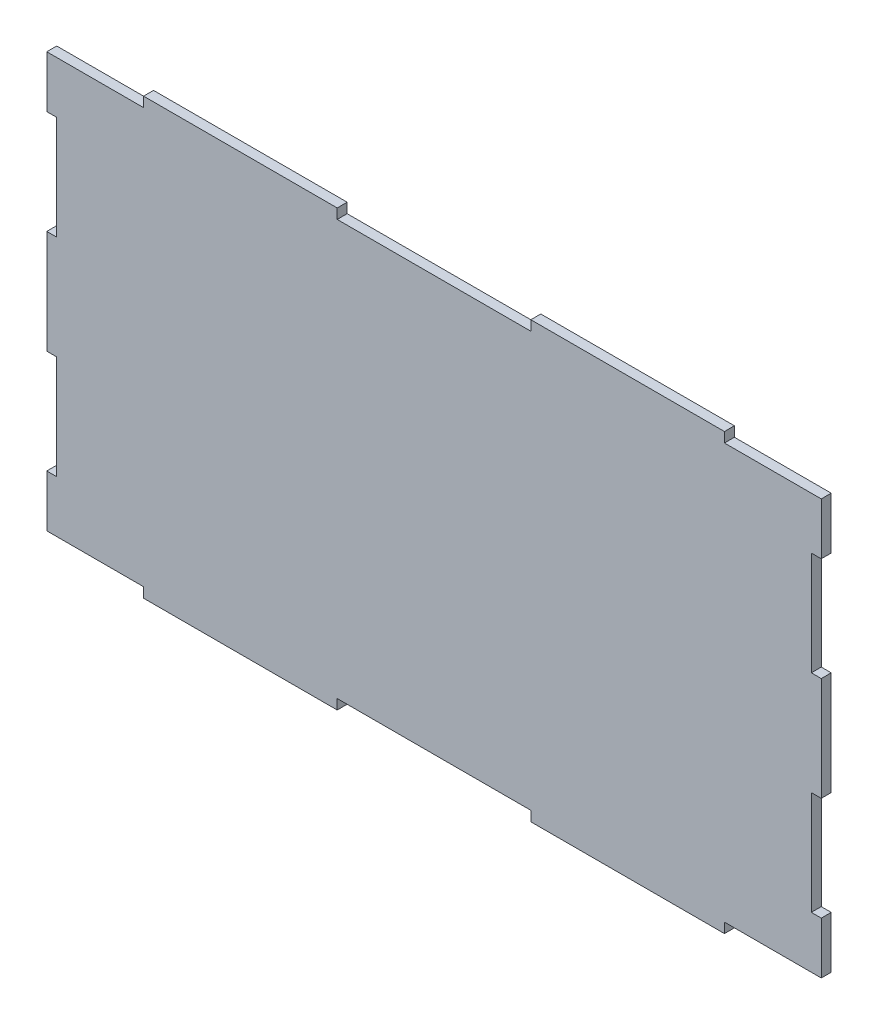
ISO-10303-21;
HEADER;
FILE_DESCRIPTION(('STEP AP214'),'2;1');
FILE_NAME('part.step','',(''),(''),'','','');
FILE_SCHEMA(('AUTOMOTIVE_DESIGN { 1 0 10303 214 1 1 1 1 }'));
ENDSEC;
DATA;
#1=APPLICATION_CONTEXT('core data for automotive mechanical design processes');
#2=APPLICATION_PROTOCOL_DEFINITION('international standard','automotive_design',2000,#1);
#3=PRODUCT_CONTEXT('',#1,'mechanical');
#4=PRODUCT('Part','Part','',(#3));
#5=PRODUCT_RELATED_PRODUCT_CATEGORY('part','',(#4));
#6=PRODUCT_DEFINITION_FORMATION('','',#4);
#7=PRODUCT_DEFINITION_CONTEXT('part definition',#1,'design');
#8=PRODUCT_DEFINITION('design','',#6,#7);
#9=PRODUCT_DEFINITION_SHAPE('','',#8);
#10=(LENGTH_UNIT() NAMED_UNIT(*) SI_UNIT(.MILLI.,.METRE.));
#11=(NAMED_UNIT(*) PLANE_ANGLE_UNIT() SI_UNIT($,.RADIAN.));
#12=(NAMED_UNIT(*) SI_UNIT($,.STERADIAN.) SOLID_ANGLE_UNIT());
#13=UNCERTAINTY_MEASURE_WITH_UNIT(LENGTH_MEASURE(1.E-05),#10,'distance_accuracy_value','');
#14=(GEOMETRIC_REPRESENTATION_CONTEXT(3) GLOBAL_UNCERTAINTY_ASSIGNED_CONTEXT((#13)) GLOBAL_UNIT_ASSIGNED_CONTEXT((#10,
#11,#12)) REPRESENTATION_CONTEXT('',''));
#15=CARTESIAN_POINT('',(0.,0.,0.));
#16=DIRECTION('',(0.,0.,1.));
#17=DIRECTION('',(1.,0.,0.));
#18=AXIS2_PLACEMENT_3D('',#15,#16,#17);
#19=CARTESIAN_POINT('',(140.,-75.,3.6));
#20=DIRECTION('',(-1.,0.,0.));
#21=DIRECTION('',(0.,-1.,0.));
#22=AXIS2_PLACEMENT_3D('',#19,#20,#21);
#23=PLANE('',#22);
#24=DIRECTION('',(0.,1.,0.));
#25=VECTOR('',#24,1.);
#26=CARTESIAN_POINT('',(140.,-75.,0.));
#27=LINE('',#26,#25);
#28=CARTESIAN_POINT('',(140.,-75.,0.));
#29=VERTEX_POINT('',#28);
#30=CARTESIAN_POINT('',(140.,-56.2500000000001,0.));
#31=VERTEX_POINT('',#30);
#32=EDGE_CURVE('E297',#29,#31,#27,.T.);
#33=ORIENTED_EDGE('',*,*,#32,.T.);
#34=DIRECTION('',(0.,0.,-1.));
#35=VECTOR('',#34,1.);
#36=CARTESIAN_POINT('',(140.,-56.2500000000001,3.6));
#37=LINE('',#36,#35);
#38=CARTESIAN_POINT('',(140.,-56.2500000000001,3.6));
#39=VERTEX_POINT('',#38);
#40=EDGE_CURVE('E11',#39,#31,#37,.T.);
#41=ORIENTED_EDGE('',*,*,#40,.F.);
#42=DIRECTION('',(0.,1.,0.));
#43=VECTOR('',#42,1.);
#44=CARTESIAN_POINT('',(140.,-75.,3.6));
#45=LINE('',#44,#43);
#46=CARTESIAN_POINT('',(140.,-75.,3.6));
#47=VERTEX_POINT('',#46);
#48=EDGE_CURVE('E367',#47,#39,#45,.T.);
#49=ORIENTED_EDGE('',*,*,#48,.F.);
#50=DIRECTION('',(0.,0.,-1.));
#51=VECTOR('',#50,1.);
#52=CARTESIAN_POINT('',(140.,-75.,3.6));
#53=LINE('',#52,#51);
#54=EDGE_CURVE('E293',#47,#29,#53,.T.);
#55=ORIENTED_EDGE('',*,*,#54,.T.);
#56=EDGE_LOOP('',(#33,#41,#49,#55));
#57=FACE_BOUND('',#56,.T.);
#58=ADVANCED_FACE('F33',(#57),#23,.F.);
#59=CARTESIAN_POINT('',(140.,-56.2500000000001,3.6));
#60=DIRECTION('',(0.,-1.,0.));
#61=DIRECTION('',(1.,0.,0.));
#62=AXIS2_PLACEMENT_3D('',#59,#60,#61);
#63=PLANE('',#62);
#64=DIRECTION('',(-1.,0.,0.));
#65=VECTOR('',#64,1.);
#66=CARTESIAN_POINT('',(140.,-56.2500000000001,0.));
#67=LINE('',#66,#65);
#68=CARTESIAN_POINT('',(136.4,-56.2500000000001,0.));
#69=VERTEX_POINT('',#68);
#70=EDGE_CURVE('E300',#31,#69,#67,.T.);
#71=ORIENTED_EDGE('',*,*,#70,.T.);
#72=DIRECTION('',(0.,0.,-1.));
#73=VECTOR('',#72,1.);
#74=CARTESIAN_POINT('',(136.4,-56.2500000000001,3.6));
#75=LINE('',#74,#73);
#76=CARTESIAN_POINT('',(136.4,-56.2500000000001,3.6));
#77=VERTEX_POINT('',#76);
#78=EDGE_CURVE('E41',#77,#69,#75,.T.);
#79=ORIENTED_EDGE('',*,*,#78,.F.);
#80=DIRECTION('',(-1.,0.,0.));
#81=VECTOR('',#80,1.);
#82=CARTESIAN_POINT('',(140.,-56.2500000000001,3.6));
#83=LINE('',#82,#81);
#84=EDGE_CURVE('E176',#39,#77,#83,.T.);
#85=ORIENTED_EDGE('',*,*,#84,.F.);
#86=ORIENTED_EDGE('',*,*,#40,.T.);
#87=EDGE_LOOP('',(#71,#79,#85,#86));
#88=FACE_BOUND('',#87,.T.);
#89=ADVANCED_FACE('F565',(#88),#63,.F.);
#90=CARTESIAN_POINT('',(136.4,-56.2500000000001,3.6));
#91=DIRECTION('',(-1.,0.,0.));
#92=DIRECTION('',(0.,-1.,0.));
#93=AXIS2_PLACEMENT_3D('',#90,#91,#92);
#94=PLANE('',#93);
#95=DIRECTION('',(0.,1.,0.));
#96=VECTOR('',#95,1.);
#97=CARTESIAN_POINT('',(136.4,-56.2500000000001,0.));
#98=LINE('',#97,#96);
#99=CARTESIAN_POINT('',(136.4,-18.7500000000001,0.));
#100=VERTEX_POINT('',#99);
#101=EDGE_CURVE('E302',#69,#100,#98,.T.);
#102=ORIENTED_EDGE('',*,*,#101,.T.);
#103=DIRECTION('',(0.,0.,-1.));
#104=VECTOR('',#103,1.);
#105=CARTESIAN_POINT('',(136.4,-18.7500000000001,3.6));
#106=LINE('',#105,#104);
#107=CARTESIAN_POINT('',(136.4,-18.7500000000001,3.6));
#108=VERTEX_POINT('',#107);
#109=EDGE_CURVE('E458',#108,#100,#106,.T.);
#110=ORIENTED_EDGE('',*,*,#109,.F.);
#111=DIRECTION('',(0.,1.,0.));
#112=VECTOR('',#111,1.);
#113=CARTESIAN_POINT('',(136.4,-56.2500000000001,3.6));
#114=LINE('',#113,#112);
#115=EDGE_CURVE('E466',#77,#108,#114,.T.);
#116=ORIENTED_EDGE('',*,*,#115,.F.);
#117=ORIENTED_EDGE('',*,*,#78,.T.);
#118=EDGE_LOOP('',(#102,#110,#116,#117));
#119=FACE_BOUND('',#118,.T.);
#120=ADVANCED_FACE('F464',(#119),#94,.F.);
#121=CARTESIAN_POINT('',(140.,-18.7500000000001,3.6));
#122=DIRECTION('',(0.,1.,0.));
#123=DIRECTION('',(-1.,0.,0.));
#124=AXIS2_PLACEMENT_3D('',#121,#122,#123);
#125=PLANE('',#124);
#126=DIRECTION('',(1.,0.,0.));
#127=VECTOR('',#126,1.);
#128=CARTESIAN_POINT('',(140.,-18.7500000000001,0.));
#129=LINE('',#128,#127);
#130=CARTESIAN_POINT('',(140.,-18.7500000000001,0.));
#131=VERTEX_POINT('',#130);
#132=EDGE_CURVE('E304',#100,#131,#129,.T.);
#133=ORIENTED_EDGE('',*,*,#132,.T.);
#134=DIRECTION('',(0.,0.,-1.));
#135=VECTOR('',#134,1.);
#136=CARTESIAN_POINT('',(140.,-18.7500000000001,3.6));
#137=LINE('',#136,#135);
#138=CARTESIAN_POINT('',(140.,-18.7500000000001,3.6));
#139=VERTEX_POINT('',#138);
#140=EDGE_CURVE('E455',#139,#131,#137,.T.);
#141=ORIENTED_EDGE('',*,*,#140,.F.);
#142=DIRECTION('',(1.,0.,0.));
#143=VECTOR('',#142,1.);
#144=CARTESIAN_POINT('',(140.,-18.7500000000001,3.6));
#145=LINE('',#144,#143);
#146=EDGE_CURVE('E484',#108,#139,#145,.T.);
#147=ORIENTED_EDGE('',*,*,#146,.F.);
#148=ORIENTED_EDGE('',*,*,#109,.T.);
#149=EDGE_LOOP('',(#133,#141,#147,#148));
#150=FACE_BOUND('',#149,.T.);
#151=ADVANCED_FACE('F475',(#150),#125,.F.);
#152=CARTESIAN_POINT('',(140.,18.7499999999999,3.6));
#153=DIRECTION('',(-1.,0.,0.));
#154=DIRECTION('',(0.,-1.,0.));
#155=AXIS2_PLACEMENT_3D('',#152,#153,#154);
#156=PLANE('',#155);
#157=DIRECTION('',(0.,1.,0.));
#158=VECTOR('',#157,1.);
#159=CARTESIAN_POINT('',(140.,18.7499999999999,0.));
#160=LINE('',#159,#158);
#161=CARTESIAN_POINT('',(140.,18.7499999999999,0.));
#162=VERTEX_POINT('',#161);
#163=EDGE_CURVE('E306',#131,#162,#160,.T.);
#164=ORIENTED_EDGE('',*,*,#163,.T.);
#165=DIRECTION('',(0.,0.,-1.));
#166=VECTOR('',#165,1.);
#167=CARTESIAN_POINT('',(140.,18.7499999999999,3.6));
#168=LINE('',#167,#166);
#169=CARTESIAN_POINT('',(140.,18.7499999999999,3.6));
#170=VERTEX_POINT('',#169);
#171=EDGE_CURVE('E452',#170,#162,#168,.T.);
#172=ORIENTED_EDGE('',*,*,#171,.F.);
#173=DIRECTION('',(0.,1.,0.));
#174=VECTOR('',#173,1.);
#175=CARTESIAN_POINT('',(140.,18.7499999999999,3.6));
#176=LINE('',#175,#174);
#177=EDGE_CURVE('E481',#139,#170,#176,.T.);
#178=ORIENTED_EDGE('',*,*,#177,.F.);
#179=ORIENTED_EDGE('',*,*,#140,.T.);
#180=EDGE_LOOP('',(#164,#172,#178,#179));
#181=FACE_BOUND('',#180,.T.);
#182=ADVANCED_FACE('F479',(#181),#156,.F.);
#183=CARTESIAN_POINT('',(140.,18.7499999999999,3.6));
#184=DIRECTION('',(0.,-1.,0.));
#185=DIRECTION('',(0.,0.,-1.));
#186=AXIS2_PLACEMENT_3D('',#183,#184,#185);
#187=PLANE('',#186);
#188=DIRECTION('',(-1.,0.,0.));
#189=VECTOR('',#188,1.);
#190=CARTESIAN_POINT('',(140.,18.7499999999999,0.));
#191=LINE('',#190,#189);
#192=CARTESIAN_POINT('',(136.4,18.7499999999999,0.));
#193=VERTEX_POINT('',#192);
#194=EDGE_CURVE('E308',#162,#193,#191,.T.);
#195=ORIENTED_EDGE('',*,*,#194,.T.);
#196=DIRECTION('',(0.,0.,-1.));
#197=VECTOR('',#196,1.);
#198=CARTESIAN_POINT('',(136.4,18.7499999999999,3.6));
#199=LINE('',#198,#197);
#200=CARTESIAN_POINT('',(136.4,18.7499999999999,3.6));
#201=VERTEX_POINT('',#200);
#202=EDGE_CURVE('E449',#201,#193,#199,.T.);
#203=ORIENTED_EDGE('',*,*,#202,.F.);
#204=DIRECTION('',(-1.,0.,0.));
#205=VECTOR('',#204,1.);
#206=CARTESIAN_POINT('',(140.,18.7499999999999,3.6));
#207=LINE('',#206,#205);
#208=EDGE_CURVE('E483',#170,#201,#207,.T.);
#209=ORIENTED_EDGE('',*,*,#208,.F.);
#210=ORIENTED_EDGE('',*,*,#171,.T.);
#211=EDGE_LOOP('',(#195,#203,#209,#210));
#212=FACE_BOUND('',#211,.T.);
#213=ADVANCED_FACE('F578',(#212),#187,.F.);
#214=CARTESIAN_POINT('',(136.4,56.2499999999999,3.6));
#215=DIRECTION('',(-1.,0.,0.));
#216=DIRECTION('',(0.,-1.,0.));
#217=AXIS2_PLACEMENT_3D('',#214,#215,#216);
#218=PLANE('',#217);
#219=DIRECTION('',(0.,1.,0.));
#220=VECTOR('',#219,1.);
#221=CARTESIAN_POINT('',(136.4,56.2499999999999,0.));
#222=LINE('',#221,#220);
#223=CARTESIAN_POINT('',(136.4,56.2499999999999,0.));
#224=VERTEX_POINT('',#223);
#225=EDGE_CURVE('E310',#193,#224,#222,.T.);
#226=ORIENTED_EDGE('',*,*,#225,.T.);
#227=DIRECTION('',(0.,0.,-1.));
#228=VECTOR('',#227,1.);
#229=CARTESIAN_POINT('',(136.4,56.2499999999999,3.6));
#230=LINE('',#229,#228);
#231=CARTESIAN_POINT('',(136.4,56.2499999999999,3.6));
#232=VERTEX_POINT('',#231);
#233=EDGE_CURVE('E446',#232,#224,#230,.T.);
#234=ORIENTED_EDGE('',*,*,#233,.F.);
#235=DIRECTION('',(0.,1.,0.));
#236=VECTOR('',#235,1.);
#237=CARTESIAN_POINT('',(136.4,56.2499999999999,3.6));
#238=LINE('',#237,#236);
#239=EDGE_CURVE('E486',#201,#232,#238,.T.);
#240=ORIENTED_EDGE('',*,*,#239,.F.);
#241=ORIENTED_EDGE('',*,*,#202,.T.);
#242=EDGE_LOOP('',(#226,#234,#240,#241));
#243=FACE_BOUND('',#242,.T.);
#244=ADVANCED_FACE('F581',(#243),#218,.F.);
#245=CARTESIAN_POINT('',(140.,56.2499999999999,3.6));
#246=DIRECTION('',(0.,1.,0.));
#247=DIRECTION('',(0.,0.,1.));
#248=AXIS2_PLACEMENT_3D('',#245,#246,#247);
#249=PLANE('',#248);
#250=DIRECTION('',(1.,0.,0.));
#251=VECTOR('',#250,1.);
#252=CARTESIAN_POINT('',(140.,56.2499999999999,0.));
#253=LINE('',#252,#251);
#254=CARTESIAN_POINT('',(140.,56.2499999999999,0.));
#255=VERTEX_POINT('',#254);
#256=EDGE_CURVE('E312',#224,#255,#253,.T.);
#257=ORIENTED_EDGE('',*,*,#256,.T.);
#258=DIRECTION('',(0.,0.,-1.));
#259=VECTOR('',#258,1.);
#260=CARTESIAN_POINT('',(140.,56.2499999999999,3.6));
#261=LINE('',#260,#259);
#262=CARTESIAN_POINT('',(140.,56.2499999999999,3.6));
#263=VERTEX_POINT('',#262);
#264=EDGE_CURVE('E443',#263,#255,#261,.T.);
#265=ORIENTED_EDGE('',*,*,#264,.F.);
#266=DIRECTION('',(1.,0.,0.));
#267=VECTOR('',#266,1.);
#268=CARTESIAN_POINT('',(140.,56.2499999999999,3.6));
#269=LINE('',#268,#267);
#270=EDGE_CURVE('E492',#232,#263,#269,.T.);
#271=ORIENTED_EDGE('',*,*,#270,.F.);
#272=ORIENTED_EDGE('',*,*,#233,.T.);
#273=EDGE_LOOP('',(#257,#265,#271,#272));
#274=FACE_BOUND('',#273,.T.);
#275=ADVANCED_FACE('F585',(#274),#249,.F.);
#276=CARTESIAN_POINT('',(140.,75.,3.6));
#277=DIRECTION('',(-1.,0.,0.));
#278=DIRECTION('',(0.,-1.,0.));
#279=AXIS2_PLACEMENT_3D('',#276,#277,#278);
#280=PLANE('',#279);
#281=DIRECTION('',(0.,1.,0.));
#282=VECTOR('',#281,1.);
#283=CARTESIAN_POINT('',(140.,75.,0.));
#284=LINE('',#283,#282);
#285=CARTESIAN_POINT('',(140.,75.,0.));
#286=VERTEX_POINT('',#285);
#287=EDGE_CURVE('E314',#255,#286,#284,.T.);
#288=ORIENTED_EDGE('',*,*,#287,.T.);
#289=DIRECTION('',(0.,0.,-1.));
#290=VECTOR('',#289,1.);
#291=CARTESIAN_POINT('',(140.,75.,3.6));
#292=LINE('',#291,#290);
#293=CARTESIAN_POINT('',(140.,75.,3.6));
#294=VERTEX_POINT('',#293);
#295=EDGE_CURVE('E440',#294,#286,#292,.T.);
#296=ORIENTED_EDGE('',*,*,#295,.F.);
#297=DIRECTION('',(0.,1.,0.));
#298=VECTOR('',#297,1.);
#299=CARTESIAN_POINT('',(140.,75.,3.6));
#300=LINE('',#299,#298);
#301=EDGE_CURVE('E494',#263,#294,#300,.T.);
#302=ORIENTED_EDGE('',*,*,#301,.F.);
#303=ORIENTED_EDGE('',*,*,#264,.T.);
#304=EDGE_LOOP('',(#288,#296,#302,#303));
#305=FACE_BOUND('',#304,.T.);
#306=ADVANCED_FACE('F589',(#305),#280,.F.);
#307=CARTESIAN_POINT('',(140.,75.,3.6));
#308=DIRECTION('',(0.,-1.,0.));
#309=DIRECTION('',(1.,0.,0.));
#310=AXIS2_PLACEMENT_3D('',#307,#308,#309);
#311=PLANE('',#310);
#312=DIRECTION('',(-1.,0.,0.));
#313=VECTOR('',#312,1.);
#314=CARTESIAN_POINT('',(140.,75.,0.));
#315=LINE('',#314,#313);
#316=CARTESIAN_POINT('',(105.,75.0000000000001,0.));
#317=VERTEX_POINT('',#316);
#318=EDGE_CURVE('E316',#286,#317,#315,.T.);
#319=ORIENTED_EDGE('',*,*,#318,.T.);
#320=DIRECTION('',(0.,0.,-1.));
#321=VECTOR('',#320,1.);
#322=CARTESIAN_POINT('',(105.,75.0000000000001,3.6));
#323=LINE('',#322,#321);
#324=CARTESIAN_POINT('',(105.,75.0000000000001,3.6));
#325=VERTEX_POINT('',#324);
#326=EDGE_CURVE('E437',#325,#317,#323,.T.);
#327=ORIENTED_EDGE('',*,*,#326,.F.);
#328=DIRECTION('',(-1.,0.,0.));
#329=VECTOR('',#328,1.);
#330=CARTESIAN_POINT('',(140.,75.,3.6));
#331=LINE('',#330,#329);
#332=EDGE_CURVE('E496',#294,#325,#331,.T.);
#333=ORIENTED_EDGE('',*,*,#332,.F.);
#334=ORIENTED_EDGE('',*,*,#295,.T.);
#335=EDGE_LOOP('',(#319,#327,#333,#334));
#336=FACE_BOUND('',#335,.T.);
#337=ADVANCED_FACE('F593',(#336),#311,.F.);
#338=CARTESIAN_POINT('',(105.,75.0000000000001,3.6));
#339=DIRECTION('',(-1.,0.,0.));
#340=DIRECTION('',(0.,0.,1.));
#341=AXIS2_PLACEMENT_3D('',#338,#339,#340);
#342=PLANE('',#341);
#343=DIRECTION('',(0.,1.,0.));
#344=VECTOR('',#343,1.);
#345=CARTESIAN_POINT('',(105.,75.0000000000001,0.));
#346=LINE('',#345,#344);
#347=CARTESIAN_POINT('',(105.,78.6000000000001,0.));
#348=VERTEX_POINT('',#347);
#349=EDGE_CURVE('E318',#317,#348,#346,.T.);
#350=ORIENTED_EDGE('',*,*,#349,.T.);
#351=DIRECTION('',(0.,0.,-1.));
#352=VECTOR('',#351,1.);
#353=CARTESIAN_POINT('',(105.,78.6000000000001,3.6));
#354=LINE('',#353,#352);
#355=CARTESIAN_POINT('',(105.,78.6000000000001,3.6));
#356=VERTEX_POINT('',#355);
#357=EDGE_CURVE('E434',#356,#348,#354,.T.);
#358=ORIENTED_EDGE('',*,*,#357,.F.);
#359=DIRECTION('',(0.,1.,0.));
#360=VECTOR('',#359,1.);
#361=CARTESIAN_POINT('',(105.,75.0000000000001,3.6));
#362=LINE('',#361,#360);
#363=EDGE_CURVE('E498',#325,#356,#362,.T.);
#364=ORIENTED_EDGE('',*,*,#363,.F.);
#365=ORIENTED_EDGE('',*,*,#326,.T.);
#366=EDGE_LOOP('',(#350,#358,#364,#365));
#367=FACE_BOUND('',#366,.T.);
#368=ADVANCED_FACE('F597',(#367),#342,.F.);
#369=CARTESIAN_POINT('',(105.,78.6000000000001,3.6));
#370=DIRECTION('',(0.,-1.,0.));
#371=DIRECTION('',(1.,0.,0.));
#372=AXIS2_PLACEMENT_3D('',#369,#370,#371);
#373=PLANE('',#372);
#374=DIRECTION('',(-1.,0.,0.));
#375=VECTOR('',#374,1.);
#376=CARTESIAN_POINT('',(105.,78.6000000000001,0.));
#377=LINE('',#376,#375);
#378=CARTESIAN_POINT('',(35.,78.6,0.));
#379=VERTEX_POINT('',#378);
#380=EDGE_CURVE('E320',#348,#379,#377,.T.);
#381=ORIENTED_EDGE('',*,*,#380,.T.);
#382=DIRECTION('',(0.,0.,-1.));
#383=VECTOR('',#382,1.);
#384=CARTESIAN_POINT('',(35.,78.6,3.6));
#385=LINE('',#384,#383);
#386=CARTESIAN_POINT('',(35.,78.6,3.6));
#387=VERTEX_POINT('',#386);
#388=EDGE_CURVE('E431',#387,#379,#385,.T.);
#389=ORIENTED_EDGE('',*,*,#388,.F.);
#390=DIRECTION('',(-1.,0.,0.));
#391=VECTOR('',#390,1.);
#392=CARTESIAN_POINT('',(105.,78.6000000000001,3.6));
#393=LINE('',#392,#391);
#394=EDGE_CURVE('E500',#356,#387,#393,.T.);
#395=ORIENTED_EDGE('',*,*,#394,.F.);
#396=ORIENTED_EDGE('',*,*,#357,.T.);
#397=EDGE_LOOP('',(#381,#389,#395,#396));
#398=FACE_BOUND('',#397,.T.);
#399=ADVANCED_FACE('F601',(#398),#373,.F.);
#400=CARTESIAN_POINT('',(35.,75.,3.6));
#401=DIRECTION('',(1.,0.,0.));
#402=DIRECTION('',(0.,0.,-1.));
#403=AXIS2_PLACEMENT_3D('',#400,#401,#402);
#404=PLANE('',#403);
#405=DIRECTION('',(0.,-1.,0.));
#406=VECTOR('',#405,1.);
#407=CARTESIAN_POINT('',(35.,75.,0.));
#408=LINE('',#407,#406);
#409=CARTESIAN_POINT('',(35.,75.,0.));
#410=VERTEX_POINT('',#409);
#411=EDGE_CURVE('E322',#379,#410,#408,.T.);
#412=ORIENTED_EDGE('',*,*,#411,.T.);
#413=DIRECTION('',(0.,0.,-1.));
#414=VECTOR('',#413,1.);
#415=CARTESIAN_POINT('',(35.,75.,3.6));
#416=LINE('',#415,#414);
#417=CARTESIAN_POINT('',(35.,75.,3.6));
#418=VERTEX_POINT('',#417);
#419=EDGE_CURVE('E428',#418,#410,#416,.T.);
#420=ORIENTED_EDGE('',*,*,#419,.F.);
#421=DIRECTION('',(0.,-1.,0.));
#422=VECTOR('',#421,1.);
#423=CARTESIAN_POINT('',(35.,75.,3.6));
#424=LINE('',#423,#422);
#425=EDGE_CURVE('E502',#387,#418,#424,.T.);
#426=ORIENTED_EDGE('',*,*,#425,.F.);
#427=ORIENTED_EDGE('',*,*,#388,.T.);
#428=EDGE_LOOP('',(#412,#420,#426,#427));
#429=FACE_BOUND('',#428,.T.);
#430=ADVANCED_FACE('F605',(#429),#404,.F.);
#431=CARTESIAN_POINT('',(35.,75.,3.6));
#432=DIRECTION('',(0.,-1.,0.));
#433=DIRECTION('',(1.,0.,0.));
#434=AXIS2_PLACEMENT_3D('',#431,#432,#433);
#435=PLANE('',#434);
#436=DIRECTION('',(-1.,0.,0.));
#437=VECTOR('',#436,1.);
#438=CARTESIAN_POINT('',(35.,75.,0.));
#439=LINE('',#438,#437);
#440=CARTESIAN_POINT('',(-35.,75.,0.));
#441=VERTEX_POINT('',#440);
#442=EDGE_CURVE('E324',#410,#441,#439,.T.);
#443=ORIENTED_EDGE('',*,*,#442,.T.);
#444=DIRECTION('',(0.,0.,-1.));
#445=VECTOR('',#444,1.);
#446=CARTESIAN_POINT('',(-35.,75.,3.6));
#447=LINE('',#446,#445);
#448=CARTESIAN_POINT('',(-35.,75.,3.6));
#449=VERTEX_POINT('',#448);
#450=EDGE_CURVE('E425',#449,#441,#447,.T.);
#451=ORIENTED_EDGE('',*,*,#450,.F.);
#452=DIRECTION('',(-1.,0.,0.));
#453=VECTOR('',#452,1.);
#454=CARTESIAN_POINT('',(35.,75.,3.6));
#455=LINE('',#454,#453);
#456=EDGE_CURVE('E504',#418,#449,#455,.T.);
#457=ORIENTED_EDGE('',*,*,#456,.F.);
#458=ORIENTED_EDGE('',*,*,#419,.T.);
#459=EDGE_LOOP('',(#443,#451,#457,#458));
#460=FACE_BOUND('',#459,.T.);
#461=ADVANCED_FACE('F609',(#460),#435,.F.);
#462=CARTESIAN_POINT('',(-35.,75.,3.6));
#463=DIRECTION('',(-1.,0.,0.));
#464=DIRECTION('',(0.,0.,1.));
#465=AXIS2_PLACEMENT_3D('',#462,#463,#464);
#466=PLANE('',#465);
#467=DIRECTION('',(0.,1.,0.));
#468=VECTOR('',#467,1.);
#469=CARTESIAN_POINT('',(-35.,75.,0.));
#470=LINE('',#469,#468);
#471=CARTESIAN_POINT('',(-35.,78.6,0.));
#472=VERTEX_POINT('',#471);
#473=EDGE_CURVE('E326',#441,#472,#470,.T.);
#474=ORIENTED_EDGE('',*,*,#473,.T.);
#475=DIRECTION('',(0.,0.,-1.));
#476=VECTOR('',#475,1.);
#477=CARTESIAN_POINT('',(-35.,78.6,3.6));
#478=LINE('',#477,#476);
#479=CARTESIAN_POINT('',(-35.,78.6,3.6));
#480=VERTEX_POINT('',#479);
#481=EDGE_CURVE('E422',#480,#472,#478,.T.);
#482=ORIENTED_EDGE('',*,*,#481,.F.);
#483=DIRECTION('',(0.,1.,0.));
#484=VECTOR('',#483,1.);
#485=CARTESIAN_POINT('',(-35.,75.,3.6));
#486=LINE('',#485,#484);
#487=EDGE_CURVE('E506',#449,#480,#486,.T.);
#488=ORIENTED_EDGE('',*,*,#487,.F.);
#489=ORIENTED_EDGE('',*,*,#450,.T.);
#490=EDGE_LOOP('',(#474,#482,#488,#489));
#491=FACE_BOUND('',#490,.T.);
#492=ADVANCED_FACE('F613',(#491),#466,.F.);
#493=CARTESIAN_POINT('',(-105.,78.6,3.6));
#494=DIRECTION('',(0.,-1.,0.));
#495=DIRECTION('',(0.,0.,-1.));
#496=AXIS2_PLACEMENT_3D('',#493,#494,#495);
#497=PLANE('',#496);
#498=DIRECTION('',(-1.,0.,0.));
#499=VECTOR('',#498,1.);
#500=CARTESIAN_POINT('',(-105.,78.6,0.));
#501=LINE('',#500,#499);
#502=CARTESIAN_POINT('',(-105.,78.6,0.));
#503=VERTEX_POINT('',#502);
#504=EDGE_CURVE('E328',#472,#503,#501,.T.);
#505=ORIENTED_EDGE('',*,*,#504,.T.);
#506=DIRECTION('',(0.,0.,-1.));
#507=VECTOR('',#506,1.);
#508=CARTESIAN_POINT('',(-105.,78.6,3.6));
#509=LINE('',#508,#507);
#510=CARTESIAN_POINT('',(-105.,78.6,3.6));
#511=VERTEX_POINT('',#510);
#512=EDGE_CURVE('E419',#511,#503,#509,.T.);
#513=ORIENTED_EDGE('',*,*,#512,.F.);
#514=DIRECTION('',(-1.,0.,0.));
#515=VECTOR('',#514,1.);
#516=CARTESIAN_POINT('',(-105.,78.6,3.6));
#517=LINE('',#516,#515);
#518=EDGE_CURVE('E508',#480,#511,#517,.T.);
#519=ORIENTED_EDGE('',*,*,#518,.F.);
#520=ORIENTED_EDGE('',*,*,#481,.T.);
#521=EDGE_LOOP('',(#505,#513,#519,#520));
#522=FACE_BOUND('',#521,.T.);
#523=ADVANCED_FACE('F617',(#522),#497,.F.);
#524=CARTESIAN_POINT('',(-105.,75.,3.6));
#525=DIRECTION('',(1.,0.,0.));
#526=DIRECTION('',(0.,0.,-1.));
#527=AXIS2_PLACEMENT_3D('',#524,#525,#526);
#528=PLANE('',#527);
#529=DIRECTION('',(0.,-1.,0.));
#530=VECTOR('',#529,1.);
#531=CARTESIAN_POINT('',(-105.,75.,0.));
#532=LINE('',#531,#530);
#533=CARTESIAN_POINT('',(-105.,75.,0.));
#534=VERTEX_POINT('',#533);
#535=EDGE_CURVE('E330',#503,#534,#532,.T.);
#536=ORIENTED_EDGE('',*,*,#535,.T.);
#537=DIRECTION('',(0.,0.,-1.));
#538=VECTOR('',#537,1.);
#539=CARTESIAN_POINT('',(-105.,75.,3.6));
#540=LINE('',#539,#538);
#541=CARTESIAN_POINT('',(-105.,75.,3.6));
#542=VERTEX_POINT('',#541);
#543=EDGE_CURVE('E416',#542,#534,#540,.T.);
#544=ORIENTED_EDGE('',*,*,#543,.F.);
#545=DIRECTION('',(0.,-1.,0.));
#546=VECTOR('',#545,1.);
#547=CARTESIAN_POINT('',(-105.,75.,3.6));
#548=LINE('',#547,#546);
#549=EDGE_CURVE('E510',#511,#542,#548,.T.);
#550=ORIENTED_EDGE('',*,*,#549,.F.);
#551=ORIENTED_EDGE('',*,*,#512,.T.);
#552=EDGE_LOOP('',(#536,#544,#550,#551));
#553=FACE_BOUND('',#552,.T.);
#554=ADVANCED_FACE('F621',(#553),#528,.F.);
#555=CARTESIAN_POINT('',(-140.,75.,3.6));
#556=DIRECTION('',(0.,-1.,0.));
#557=DIRECTION('',(0.,0.,-1.));
#558=AXIS2_PLACEMENT_3D('',#555,#556,#557);
#559=PLANE('',#558);
#560=DIRECTION('',(-1.,0.,0.));
#561=VECTOR('',#560,1.);
#562=CARTESIAN_POINT('',(-140.,75.,0.));
#563=LINE('',#562,#561);
#564=CARTESIAN_POINT('',(-140.,75.,0.));
#565=VERTEX_POINT('',#564);
#566=EDGE_CURVE('E332',#534,#565,#563,.T.);
#567=ORIENTED_EDGE('',*,*,#566,.T.);
#568=DIRECTION('',(0.,0.,-1.));
#569=VECTOR('',#568,1.);
#570=CARTESIAN_POINT('',(-140.,75.,3.6));
#571=LINE('',#570,#569);
#572=CARTESIAN_POINT('',(-140.,75.,3.6));
#573=VERTEX_POINT('',#572);
#574=EDGE_CURVE('E413',#573,#565,#571,.T.);
#575=ORIENTED_EDGE('',*,*,#574,.F.);
#576=DIRECTION('',(-1.,0.,0.));
#577=VECTOR('',#576,1.);
#578=CARTESIAN_POINT('',(-140.,75.,3.6));
#579=LINE('',#578,#577);
#580=EDGE_CURVE('E512',#542,#573,#579,.T.);
#581=ORIENTED_EDGE('',*,*,#580,.F.);
#582=ORIENTED_EDGE('',*,*,#543,.T.);
#583=EDGE_LOOP('',(#567,#575,#581,#582));
#584=FACE_BOUND('',#583,.T.);
#585=ADVANCED_FACE('F625',(#584),#559,.F.);
#586=CARTESIAN_POINT('',(-140.,75.,3.6));
#587=DIRECTION('',(1.,0.,0.));
#588=DIRECTION('',(0.,1.,0.));
#589=AXIS2_PLACEMENT_3D('',#586,#587,#588);
#590=PLANE('',#589);
#591=DIRECTION('',(0.,-1.,0.));
#592=VECTOR('',#591,1.);
#593=CARTESIAN_POINT('',(-140.,75.,0.));
#594=LINE('',#593,#592);
#595=CARTESIAN_POINT('',(-140.,56.25,0.));
#596=VERTEX_POINT('',#595);
#597=EDGE_CURVE('E334',#565,#596,#594,.T.);
#598=ORIENTED_EDGE('',*,*,#597,.T.);
#599=DIRECTION('',(0.,0.,-1.));
#600=VECTOR('',#599,1.);
#601=CARTESIAN_POINT('',(-140.,56.25,3.6));
#602=LINE('',#601,#600);
#603=CARTESIAN_POINT('',(-140.,56.25,3.6));
#604=VERTEX_POINT('',#603);
#605=EDGE_CURVE('E410',#604,#596,#602,.T.);
#606=ORIENTED_EDGE('',*,*,#605,.F.);
#607=DIRECTION('',(0.,-1.,0.));
#608=VECTOR('',#607,1.);
#609=CARTESIAN_POINT('',(-140.,75.,3.6));
#610=LINE('',#609,#608);
#611=EDGE_CURVE('E514',#573,#604,#610,.T.);
#612=ORIENTED_EDGE('',*,*,#611,.F.);
#613=ORIENTED_EDGE('',*,*,#574,.T.);
#614=EDGE_LOOP('',(#598,#606,#612,#613));
#615=FACE_BOUND('',#614,.T.);
#616=ADVANCED_FACE('F629',(#615),#590,.F.);
#617=CARTESIAN_POINT('',(-140.,56.25,3.6));
#618=DIRECTION('',(0.,1.,0.));
#619=DIRECTION('',(0.,0.,1.));
#620=AXIS2_PLACEMENT_3D('',#617,#618,#619);
#621=PLANE('',#620);
#622=DIRECTION('',(1.,0.,0.));
#623=VECTOR('',#622,1.);
#624=CARTESIAN_POINT('',(-140.,56.25,0.));
#625=LINE('',#624,#623);
#626=CARTESIAN_POINT('',(-136.4,56.25,0.));
#627=VERTEX_POINT('',#626);
#628=EDGE_CURVE('E336',#596,#627,#625,.T.);
#629=ORIENTED_EDGE('',*,*,#628,.T.);
#630=DIRECTION('',(0.,0.,-1.));
#631=VECTOR('',#630,1.);
#632=CARTESIAN_POINT('',(-136.4,56.25,3.6));
#633=LINE('',#632,#631);
#634=CARTESIAN_POINT('',(-136.4,56.25,3.6));
#635=VERTEX_POINT('',#634);
#636=EDGE_CURVE('E407',#635,#627,#633,.T.);
#637=ORIENTED_EDGE('',*,*,#636,.F.);
#638=DIRECTION('',(1.,0.,0.));
#639=VECTOR('',#638,1.);
#640=CARTESIAN_POINT('',(-140.,56.25,3.6));
#641=LINE('',#640,#639);
#642=EDGE_CURVE('E516',#604,#635,#641,.T.);
#643=ORIENTED_EDGE('',*,*,#642,.F.);
#644=ORIENTED_EDGE('',*,*,#605,.T.);
#645=EDGE_LOOP('',(#629,#637,#643,#644));
#646=FACE_BOUND('',#645,.T.);
#647=ADVANCED_FACE('F633',(#646),#621,.F.);
#648=CARTESIAN_POINT('',(-136.4,56.25,3.6));
#649=DIRECTION('',(1.,0.,0.));
#650=DIRECTION('',(0.,0.,-1.));
#651=AXIS2_PLACEMENT_3D('',#648,#649,#650);
#652=PLANE('',#651);
#653=DIRECTION('',(0.,-1.,0.));
#654=VECTOR('',#653,1.);
#655=CARTESIAN_POINT('',(-136.4,56.25,0.));
#656=LINE('',#655,#654);
#657=CARTESIAN_POINT('',(-136.4,18.75,0.));
#658=VERTEX_POINT('',#657);
#659=EDGE_CURVE('E338',#627,#658,#656,.T.);
#660=ORIENTED_EDGE('',*,*,#659,.T.);
#661=DIRECTION('',(0.,0.,-1.));
#662=VECTOR('',#661,1.);
#663=CARTESIAN_POINT('',(-136.4,18.75,3.6));
#664=LINE('',#663,#662);
#665=CARTESIAN_POINT('',(-136.4,18.75,3.6));
#666=VERTEX_POINT('',#665);
#667=EDGE_CURVE('E404',#666,#658,#664,.T.);
#668=ORIENTED_EDGE('',*,*,#667,.F.);
#669=DIRECTION('',(0.,-1.,0.));
#670=VECTOR('',#669,1.);
#671=CARTESIAN_POINT('',(-136.4,56.25,3.6));
#672=LINE('',#671,#670);
#673=EDGE_CURVE('E518',#635,#666,#672,.T.);
#674=ORIENTED_EDGE('',*,*,#673,.F.);
#675=ORIENTED_EDGE('',*,*,#636,.T.);
#676=EDGE_LOOP('',(#660,#668,#674,#675));
#677=FACE_BOUND('',#676,.T.);
#678=ADVANCED_FACE('F637',(#677),#652,.F.);
#679=CARTESIAN_POINT('',(-140.,18.75,3.6));
#680=DIRECTION('',(0.,-1.,0.));
#681=DIRECTION('',(0.,0.,-1.));
#682=AXIS2_PLACEMENT_3D('',#679,#680,#681);
#683=PLANE('',#682);
#684=DIRECTION('',(-1.,0.,0.));
#685=VECTOR('',#684,1.);
#686=CARTESIAN_POINT('',(-140.,18.75,0.));
#687=LINE('',#686,#685);
#688=CARTESIAN_POINT('',(-140.,18.75,0.));
#689=VERTEX_POINT('',#688);
#690=EDGE_CURVE('E340',#658,#689,#687,.T.);
#691=ORIENTED_EDGE('',*,*,#690,.T.);
#692=DIRECTION('',(0.,0.,-1.));
#693=VECTOR('',#692,1.);
#694=CARTESIAN_POINT('',(-140.,18.75,3.6));
#695=LINE('',#694,#693);
#696=CARTESIAN_POINT('',(-140.,18.75,3.6));
#697=VERTEX_POINT('',#696);
#698=EDGE_CURVE('E401',#697,#689,#695,.T.);
#699=ORIENTED_EDGE('',*,*,#698,.F.);
#700=DIRECTION('',(-1.,0.,0.));
#701=VECTOR('',#700,1.);
#702=CARTESIAN_POINT('',(-140.,18.75,3.6));
#703=LINE('',#702,#701);
#704=EDGE_CURVE('E520',#666,#697,#703,.T.);
#705=ORIENTED_EDGE('',*,*,#704,.F.);
#706=ORIENTED_EDGE('',*,*,#667,.T.);
#707=EDGE_LOOP('',(#691,#699,#705,#706));
#708=FACE_BOUND('',#707,.T.);
#709=ADVANCED_FACE('F641',(#708),#683,.F.);
#710=CARTESIAN_POINT('',(-140.,18.75,3.6));
#711=DIRECTION('',(1.,0.,0.));
#712=DIRECTION('',(0.,1.,0.));
#713=AXIS2_PLACEMENT_3D('',#710,#711,#712);
#714=PLANE('',#713);
#715=DIRECTION('',(0.,-1.,0.));
#716=VECTOR('',#715,1.);
#717=CARTESIAN_POINT('',(-140.,18.75,0.));
#718=LINE('',#717,#716);
#719=CARTESIAN_POINT('',(-140.,-18.75,0.));
#720=VERTEX_POINT('',#719);
#721=EDGE_CURVE('E342',#689,#720,#718,.T.);
#722=ORIENTED_EDGE('',*,*,#721,.T.);
#723=DIRECTION('',(0.,0.,-1.));
#724=VECTOR('',#723,1.);
#725=CARTESIAN_POINT('',(-140.,-18.75,3.6));
#726=LINE('',#725,#724);
#727=CARTESIAN_POINT('',(-140.,-18.75,3.6));
#728=VERTEX_POINT('',#727);
#729=EDGE_CURVE('E398',#728,#720,#726,.T.);
#730=ORIENTED_EDGE('',*,*,#729,.F.);
#731=DIRECTION('',(0.,-1.,0.));
#732=VECTOR('',#731,1.);
#733=CARTESIAN_POINT('',(-140.,18.75,3.6));
#734=LINE('',#733,#732);
#735=EDGE_CURVE('E522',#697,#728,#734,.T.);
#736=ORIENTED_EDGE('',*,*,#735,.F.);
#737=ORIENTED_EDGE('',*,*,#698,.T.);
#738=EDGE_LOOP('',(#722,#730,#736,#737));
#739=FACE_BOUND('',#738,.T.);
#740=ADVANCED_FACE('F645',(#739),#714,.F.);
#741=CARTESIAN_POINT('',(-140.,-18.75,3.6));
#742=DIRECTION('',(0.,1.,0.));
#743=DIRECTION('',(-1.,0.,0.));
#744=AXIS2_PLACEMENT_3D('',#741,#742,#743);
#745=PLANE('',#744);
#746=DIRECTION('',(1.,0.,0.));
#747=VECTOR('',#746,1.);
#748=CARTESIAN_POINT('',(-140.,-18.75,0.));
#749=LINE('',#748,#747);
#750=CARTESIAN_POINT('',(-136.4,-18.75,0.));
#751=VERTEX_POINT('',#750);
#752=EDGE_CURVE('E344',#720,#751,#749,.T.);
#753=ORIENTED_EDGE('',*,*,#752,.T.);
#754=DIRECTION('',(0.,0.,-1.));
#755=VECTOR('',#754,1.);
#756=CARTESIAN_POINT('',(-136.4,-18.75,3.6));
#757=LINE('',#756,#755);
#758=CARTESIAN_POINT('',(-136.4,-18.75,3.6));
#759=VERTEX_POINT('',#758);
#760=EDGE_CURVE('E395',#759,#751,#757,.T.);
#761=ORIENTED_EDGE('',*,*,#760,.F.);
#762=DIRECTION('',(1.,0.,0.));
#763=VECTOR('',#762,1.);
#764=CARTESIAN_POINT('',(-140.,-18.75,3.6));
#765=LINE('',#764,#763);
#766=EDGE_CURVE('E524',#728,#759,#765,.T.);
#767=ORIENTED_EDGE('',*,*,#766,.F.);
#768=ORIENTED_EDGE('',*,*,#729,.T.);
#769=EDGE_LOOP('',(#753,#761,#767,#768));
#770=FACE_BOUND('',#769,.T.);
#771=ADVANCED_FACE('F649',(#770),#745,.F.);
#772=CARTESIAN_POINT('',(-136.4,-56.25,3.6));
#773=DIRECTION('',(1.,0.,0.));
#774=DIRECTION('',(0.,1.,0.));
#775=AXIS2_PLACEMENT_3D('',#772,#773,#774);
#776=PLANE('',#775);
#777=DIRECTION('',(0.,-1.,0.));
#778=VECTOR('',#777,1.);
#779=CARTESIAN_POINT('',(-136.4,-56.25,0.));
#780=LINE('',#779,#778);
#781=CARTESIAN_POINT('',(-136.4,-56.25,0.));
#782=VERTEX_POINT('',#781);
#783=EDGE_CURVE('E346',#751,#782,#780,.T.);
#784=ORIENTED_EDGE('',*,*,#783,.T.);
#785=DIRECTION('',(0.,0.,-1.));
#786=VECTOR('',#785,1.);
#787=CARTESIAN_POINT('',(-136.4,-56.25,3.6));
#788=LINE('',#787,#786);
#789=CARTESIAN_POINT('',(-136.4,-56.25,3.6));
#790=VERTEX_POINT('',#789);
#791=EDGE_CURVE('E392',#790,#782,#788,.T.);
#792=ORIENTED_EDGE('',*,*,#791,.F.);
#793=DIRECTION('',(0.,-1.,0.));
#794=VECTOR('',#793,1.);
#795=CARTESIAN_POINT('',(-136.4,-56.25,3.6));
#796=LINE('',#795,#794);
#797=EDGE_CURVE('E526',#759,#790,#796,.T.);
#798=ORIENTED_EDGE('',*,*,#797,.F.);
#799=ORIENTED_EDGE('',*,*,#760,.T.);
#800=EDGE_LOOP('',(#784,#792,#798,#799));
#801=FACE_BOUND('',#800,.T.);
#802=ADVANCED_FACE('F653',(#801),#776,.F.);
#803=CARTESIAN_POINT('',(-140.,-56.25,3.6));
#804=DIRECTION('',(0.,-1.,0.));
#805=DIRECTION('',(1.,0.,0.));
#806=AXIS2_PLACEMENT_3D('',#803,#804,#805);
#807=PLANE('',#806);
#808=DIRECTION('',(-1.,0.,0.));
#809=VECTOR('',#808,1.);
#810=CARTESIAN_POINT('',(-140.,-56.25,0.));
#811=LINE('',#810,#809);
#812=CARTESIAN_POINT('',(-140.,-56.25,0.));
#813=VERTEX_POINT('',#812);
#814=EDGE_CURVE('E348',#782,#813,#811,.T.);
#815=ORIENTED_EDGE('',*,*,#814,.T.);
#816=DIRECTION('',(0.,0.,-1.));
#817=VECTOR('',#816,1.);
#818=CARTESIAN_POINT('',(-140.,-56.25,3.6));
#819=LINE('',#818,#817);
#820=CARTESIAN_POINT('',(-140.,-56.25,3.6));
#821=VERTEX_POINT('',#820);
#822=EDGE_CURVE('E389',#821,#813,#819,.T.);
#823=ORIENTED_EDGE('',*,*,#822,.F.);
#824=DIRECTION('',(-1.,0.,0.));
#825=VECTOR('',#824,1.);
#826=CARTESIAN_POINT('',(-140.,-56.25,3.6));
#827=LINE('',#826,#825);
#828=EDGE_CURVE('E528',#790,#821,#827,.T.);
#829=ORIENTED_EDGE('',*,*,#828,.F.);
#830=ORIENTED_EDGE('',*,*,#791,.T.);
#831=EDGE_LOOP('',(#815,#823,#829,#830));
#832=FACE_BOUND('',#831,.T.);
#833=ADVANCED_FACE('F657',(#832),#807,.F.);
#834=CARTESIAN_POINT('',(-140.,-75.,3.6));
#835=DIRECTION('',(1.,0.,0.));
#836=DIRECTION('',(0.,1.,0.));
#837=AXIS2_PLACEMENT_3D('',#834,#835,#836);
#838=PLANE('',#837);
#839=DIRECTION('',(0.,-1.,0.));
#840=VECTOR('',#839,1.);
#841=CARTESIAN_POINT('',(-140.,-75.,0.));
#842=LINE('',#841,#840);
#843=CARTESIAN_POINT('',(-140.,-75.,0.));
#844=VERTEX_POINT('',#843);
#845=EDGE_CURVE('E350',#813,#844,#842,.T.);
#846=ORIENTED_EDGE('',*,*,#845,.T.);
#847=DIRECTION('',(0.,0.,-1.));
#848=VECTOR('',#847,1.);
#849=CARTESIAN_POINT('',(-140.,-75.,3.6));
#850=LINE('',#849,#848);
#851=CARTESIAN_POINT('',(-140.,-75.,3.6));
#852=VERTEX_POINT('',#851);
#853=EDGE_CURVE('E386',#852,#844,#850,.T.);
#854=ORIENTED_EDGE('',*,*,#853,.F.);
#855=DIRECTION('',(0.,-1.,0.));
#856=VECTOR('',#855,1.);
#857=CARTESIAN_POINT('',(-140.,-75.,3.6));
#858=LINE('',#857,#856);
#859=EDGE_CURVE('E530',#821,#852,#858,.T.);
#860=ORIENTED_EDGE('',*,*,#859,.F.);
#861=ORIENTED_EDGE('',*,*,#822,.T.);
#862=EDGE_LOOP('',(#846,#854,#860,#861));
#863=FACE_BOUND('',#862,.T.);
#864=ADVANCED_FACE('F661',(#863),#838,.F.);
#865=CARTESIAN_POINT('',(-140.,-75.,3.6));
#866=DIRECTION('',(0.,1.,0.));
#867=DIRECTION('',(-1.,0.,0.));
#868=AXIS2_PLACEMENT_3D('',#865,#866,#867);
#869=PLANE('',#868);
#870=DIRECTION('',(1.,0.,0.));
#871=VECTOR('',#870,1.);
#872=CARTESIAN_POINT('',(-140.,-75.,0.));
#873=LINE('',#872,#871);
#874=CARTESIAN_POINT('',(-105.,-74.9999999999999,0.));
#875=VERTEX_POINT('',#874);
#876=EDGE_CURVE('E352',#844,#875,#873,.T.);
#877=ORIENTED_EDGE('',*,*,#876,.T.);
#878=DIRECTION('',(0.,0.,-1.));
#879=VECTOR('',#878,1.);
#880=CARTESIAN_POINT('',(-105.,-74.9999999999999,3.6));
#881=LINE('',#880,#879);
#882=CARTESIAN_POINT('',(-105.,-74.9999999999999,3.6));
#883=VERTEX_POINT('',#882);
#884=EDGE_CURVE('E383',#883,#875,#881,.T.);
#885=ORIENTED_EDGE('',*,*,#884,.F.);
#886=DIRECTION('',(1.,0.,0.));
#887=VECTOR('',#886,1.);
#888=CARTESIAN_POINT('',(-140.,-75.,3.6));
#889=LINE('',#888,#887);
#890=EDGE_CURVE('E532',#852,#883,#889,.T.);
#891=ORIENTED_EDGE('',*,*,#890,.F.);
#892=ORIENTED_EDGE('',*,*,#853,.T.);
#893=EDGE_LOOP('',(#877,#885,#891,#892));
#894=FACE_BOUND('',#893,.T.);
#895=ADVANCED_FACE('F665',(#894),#869,.F.);
#896=CARTESIAN_POINT('',(-105.,-74.9999999999999,3.6));
#897=DIRECTION('',(1.,0.,0.));
#898=DIRECTION('',(0.,0.,-1.));
#899=AXIS2_PLACEMENT_3D('',#896,#897,#898);
#900=PLANE('',#899);
#901=DIRECTION('',(0.,-1.,0.));
#902=VECTOR('',#901,1.);
#903=CARTESIAN_POINT('',(-105.,-74.9999999999999,0.));
#904=LINE('',#903,#902);
#905=CARTESIAN_POINT('',(-105.,-78.5999999999999,0.));
#906=VERTEX_POINT('',#905);
#907=EDGE_CURVE('E354',#875,#906,#904,.T.);
#908=ORIENTED_EDGE('',*,*,#907,.T.);
#909=DIRECTION('',(0.,0.,-1.));
#910=VECTOR('',#909,1.);
#911=CARTESIAN_POINT('',(-105.,-78.5999999999999,3.6));
#912=LINE('',#911,#910);
#913=CARTESIAN_POINT('',(-105.,-78.5999999999999,3.6));
#914=VERTEX_POINT('',#913);
#915=EDGE_CURVE('E380',#914,#906,#912,.T.);
#916=ORIENTED_EDGE('',*,*,#915,.F.);
#917=DIRECTION('',(0.,-1.,0.));
#918=VECTOR('',#917,1.);
#919=CARTESIAN_POINT('',(-105.,-74.9999999999999,3.6));
#920=LINE('',#919,#918);
#921=EDGE_CURVE('E534',#883,#914,#920,.T.);
#922=ORIENTED_EDGE('',*,*,#921,.F.);
#923=ORIENTED_EDGE('',*,*,#884,.T.);
#924=EDGE_LOOP('',(#908,#916,#922,#923));
#925=FACE_BOUND('',#924,.T.);
#926=ADVANCED_FACE('F669',(#925),#900,.F.);
#927=CARTESIAN_POINT('',(-105.,-78.5999999999999,3.6));
#928=DIRECTION('',(0.,1.,0.));
#929=DIRECTION('',(-1.,0.,0.));
#930=AXIS2_PLACEMENT_3D('',#927,#928,#929);
#931=PLANE('',#930);
#932=DIRECTION('',(1.,0.,0.));
#933=VECTOR('',#932,1.);
#934=CARTESIAN_POINT('',(-105.,-78.5999999999999,0.));
#935=LINE('',#934,#933);
#936=CARTESIAN_POINT('',(-35.0000000000001,-78.6,0.));
#937=VERTEX_POINT('',#936);
#938=EDGE_CURVE('E356',#906,#937,#935,.T.);
#939=ORIENTED_EDGE('',*,*,#938,.T.);
#940=DIRECTION('',(0.,0.,-1.));
#941=VECTOR('',#940,1.);
#942=CARTESIAN_POINT('',(-35.0000000000001,-78.6,3.6));
#943=LINE('',#942,#941);
#944=CARTESIAN_POINT('',(-35.0000000000001,-78.6,3.6));
#945=VERTEX_POINT('',#944);
#946=EDGE_CURVE('E377',#945,#937,#943,.T.);
#947=ORIENTED_EDGE('',*,*,#946,.F.);
#948=DIRECTION('',(1.,0.,0.));
#949=VECTOR('',#948,1.);
#950=CARTESIAN_POINT('',(-105.,-78.5999999999999,3.6));
#951=LINE('',#950,#949);
#952=EDGE_CURVE('E536',#914,#945,#951,.T.);
#953=ORIENTED_EDGE('',*,*,#952,.F.);
#954=ORIENTED_EDGE('',*,*,#915,.T.);
#955=EDGE_LOOP('',(#939,#947,#953,#954));
#956=FACE_BOUND('',#955,.T.);
#957=ADVANCED_FACE('F673',(#956),#931,.F.);
#958=CARTESIAN_POINT('',(-35.0000000000001,-75.,3.6));
#959=DIRECTION('',(-1.,0.,0.));
#960=DIRECTION('',(0.,-1.,0.));
#961=AXIS2_PLACEMENT_3D('',#958,#959,#960);
#962=PLANE('',#961);
#963=DIRECTION('',(0.,1.,0.));
#964=VECTOR('',#963,1.);
#965=CARTESIAN_POINT('',(-35.0000000000001,-75.,0.));
#966=LINE('',#965,#964);
#967=CARTESIAN_POINT('',(-35.0000000000001,-75.,0.));
#968=VERTEX_POINT('',#967);
#969=EDGE_CURVE('E358',#937,#968,#966,.T.);
#970=ORIENTED_EDGE('',*,*,#969,.T.);
#971=DIRECTION('',(0.,0.,-1.));
#972=VECTOR('',#971,1.);
#973=CARTESIAN_POINT('',(-35.0000000000001,-75.,3.6));
#974=LINE('',#973,#972);
#975=CARTESIAN_POINT('',(-35.0000000000001,-75.,3.6));
#976=VERTEX_POINT('',#975);
#977=EDGE_CURVE('E374',#976,#968,#974,.T.);
#978=ORIENTED_EDGE('',*,*,#977,.F.);
#979=DIRECTION('',(0.,1.,0.));
#980=VECTOR('',#979,1.);
#981=CARTESIAN_POINT('',(-35.0000000000001,-75.,3.6));
#982=LINE('',#981,#980);
#983=EDGE_CURVE('E538',#945,#976,#982,.T.);
#984=ORIENTED_EDGE('',*,*,#983,.F.);
#985=ORIENTED_EDGE('',*,*,#946,.T.);
#986=EDGE_LOOP('',(#970,#978,#984,#985));
#987=FACE_BOUND('',#986,.T.);
#988=ADVANCED_FACE('F677',(#987),#962,.F.);
#989=CARTESIAN_POINT('',(35.,-75.0000000000001,3.6));
#990=DIRECTION('',(0.,1.,0.));
#991=DIRECTION('',(-1.,0.,0.));
#992=AXIS2_PLACEMENT_3D('',#989,#990,#991);
#993=PLANE('',#992);
#994=DIRECTION('',(1.,0.,0.));
#995=VECTOR('',#994,1.);
#996=CARTESIAN_POINT('',(35.,-75.0000000000001,0.));
#997=LINE('',#996,#995);
#998=CARTESIAN_POINT('',(35.,-75.0000000000001,0.));
#999=VERTEX_POINT('',#998);
#1000=EDGE_CURVE('E360',#968,#999,#997,.T.);
#1001=ORIENTED_EDGE('',*,*,#1000,.T.);
#1002=DIRECTION('',(0.,0.,-1.));
#1003=VECTOR('',#1002,1.);
#1004=CARTESIAN_POINT('',(35.,-75.0000000000001,3.6));
#1005=LINE('',#1004,#1003);
#1006=CARTESIAN_POINT('',(35.,-75.0000000000001,3.6));
#1007=VERTEX_POINT('',#1006);
#1008=EDGE_CURVE('E371',#1007,#999,#1005,.T.);
#1009=ORIENTED_EDGE('',*,*,#1008,.F.);
#1010=DIRECTION('',(1.,0.,0.));
#1011=VECTOR('',#1010,1.);
#1012=CARTESIAN_POINT('',(35.,-75.0000000000001,3.6));
#1013=LINE('',#1012,#1011);
#1014=EDGE_CURVE('E540',#976,#1007,#1013,.T.);
#1015=ORIENTED_EDGE('',*,*,#1014,.F.);
#1016=ORIENTED_EDGE('',*,*,#977,.T.);
#1017=EDGE_LOOP('',(#1001,#1009,#1015,#1016));
#1018=FACE_BOUND('',#1017,.T.);
#1019=ADVANCED_FACE('F546',(#1018),#993,.F.);
#1020=CARTESIAN_POINT('',(35.,-75.0000000000001,3.6));
#1021=DIRECTION('',(1.,0.,0.));
#1022=DIRECTION('',(0.,0.,-1.));
#1023=AXIS2_PLACEMENT_3D('',#1020,#1021,#1022);
#1024=PLANE('',#1023);
#1025=DIRECTION('',(0.,-1.,0.));
#1026=VECTOR('',#1025,1.);
#1027=CARTESIAN_POINT('',(35.,-75.0000000000001,0.));
#1028=LINE('',#1027,#1026);
#1029=CARTESIAN_POINT('',(35.,-78.6000000000001,0.));
#1030=VERTEX_POINT('',#1029);
#1031=EDGE_CURVE('E362',#999,#1030,#1028,.T.);
#1032=ORIENTED_EDGE('',*,*,#1031,.T.);
#1033=DIRECTION('',(0.,0.,-1.));
#1034=VECTOR('',#1033,1.);
#1035=CARTESIAN_POINT('',(35.,-78.6000000000001,3.6));
#1036=LINE('',#1035,#1034);
#1037=CARTESIAN_POINT('',(35.,-78.6000000000001,3.6));
#1038=VERTEX_POINT('',#1037);
#1039=EDGE_CURVE('E288',#1038,#1030,#1036,.T.);
#1040=ORIENTED_EDGE('',*,*,#1039,.F.);
#1041=DIRECTION('',(0.,-1.,0.));
#1042=VECTOR('',#1041,1.);
#1043=CARTESIAN_POINT('',(35.,-75.0000000000001,3.6));
#1044=LINE('',#1043,#1042);
#1045=EDGE_CURVE('E279',#1007,#1038,#1044,.T.);
#1046=ORIENTED_EDGE('',*,*,#1045,.F.);
#1047=ORIENTED_EDGE('',*,*,#1008,.T.);
#1048=EDGE_LOOP('',(#1032,#1040,#1046,#1047));
#1049=FACE_BOUND('',#1048,.T.);
#1050=ADVANCED_FACE('F550',(#1049),#1024,.F.);
#1051=CARTESIAN_POINT('',(105.,-78.6000000000002,3.6));
#1052=DIRECTION('',(0.,1.,0.));
#1053=DIRECTION('',(-1.,0.,0.));
#1054=AXIS2_PLACEMENT_3D('',#1051,#1052,#1053);
#1055=PLANE('',#1054);
#1056=DIRECTION('',(1.,0.,0.));
#1057=VECTOR('',#1056,1.);
#1058=CARTESIAN_POINT('',(105.,-78.6000000000002,0.));
#1059=LINE('',#1058,#1057);
#1060=CARTESIAN_POINT('',(105.,-78.6000000000002,0.));
#1061=VERTEX_POINT('',#1060);
#1062=EDGE_CURVE('E287',#1030,#1061,#1059,.T.);
#1063=ORIENTED_EDGE('',*,*,#1062,.T.);
#1064=DIRECTION('',(0.,0.,-1.));
#1065=VECTOR('',#1064,1.);
#1066=CARTESIAN_POINT('',(105.,-78.6000000000002,3.6));
#1067=LINE('',#1066,#1065);
#1068=CARTESIAN_POINT('',(105.,-78.6000000000002,3.6));
#1069=VERTEX_POINT('',#1068);
#1070=EDGE_CURVE('E284',#1069,#1061,#1067,.T.);
#1071=ORIENTED_EDGE('',*,*,#1070,.F.);
#1072=DIRECTION('',(1.,0.,0.));
#1073=VECTOR('',#1072,1.);
#1074=CARTESIAN_POINT('',(105.,-78.6000000000002,3.6));
#1075=LINE('',#1074,#1073);
#1076=EDGE_CURVE('E273',#1038,#1069,#1075,.T.);
#1077=ORIENTED_EDGE('',*,*,#1076,.F.);
#1078=ORIENTED_EDGE('',*,*,#1039,.T.);
#1079=EDGE_LOOP('',(#1063,#1071,#1077,#1078));
#1080=FACE_BOUND('',#1079,.T.);
#1081=ADVANCED_FACE('F285',(#1080),#1055,.F.);
#1082=CARTESIAN_POINT('',(105.,-75.0000000000002,3.6));
#1083=DIRECTION('',(-1.,0.,0.));
#1084=DIRECTION('',(0.,0.,1.));
#1085=AXIS2_PLACEMENT_3D('',#1082,#1083,#1084);
#1086=PLANE('',#1085);
#1087=DIRECTION('',(0.,1.,0.));
#1088=VECTOR('',#1087,1.);
#1089=CARTESIAN_POINT('',(105.,-75.0000000000002,0.));
#1090=LINE('',#1089,#1088);
#1091=CARTESIAN_POINT('',(105.,-75.0000000000002,0.));
#1092=VERTEX_POINT('',#1091);
#1093=EDGE_CURVE('E162',#1061,#1092,#1090,.T.);
#1094=ORIENTED_EDGE('',*,*,#1093,.T.);
#1095=DIRECTION('',(0.,0.,-1.));
#1096=VECTOR('',#1095,1.);
#1097=CARTESIAN_POINT('',(105.,-75.0000000000002,3.6));
#1098=LINE('',#1097,#1096);
#1099=CARTESIAN_POINT('',(105.,-75.0000000000002,3.6));
#1100=VERTEX_POINT('',#1099);
#1101=EDGE_CURVE('E289',#1100,#1092,#1098,.T.);
#1102=ORIENTED_EDGE('',*,*,#1101,.F.);
#1103=DIRECTION('',(0.,1.,0.));
#1104=VECTOR('',#1103,1.);
#1105=CARTESIAN_POINT('',(105.,-75.0000000000002,3.6));
#1106=LINE('',#1105,#1104);
#1107=EDGE_CURVE('E277',#1069,#1100,#1106,.T.);
#1108=ORIENTED_EDGE('',*,*,#1107,.F.);
#1109=ORIENTED_EDGE('',*,*,#1070,.T.);
#1110=EDGE_LOOP('',(#1094,#1102,#1108,#1109));
#1111=FACE_BOUND('',#1110,.T.);
#1112=ADVANCED_FACE('F291',(#1111),#1086,.F.);
#1113=CARTESIAN_POINT('',(140.,-75.,3.6));
#1114=DIRECTION('',(0.,1.,0.));
#1115=DIRECTION('',(-1.,0.,0.));
#1116=AXIS2_PLACEMENT_3D('',#1113,#1114,#1115);
#1117=PLANE('',#1116);
#1118=DIRECTION('',(1.,0.,0.));
#1119=VECTOR('',#1118,1.);
#1120=CARTESIAN_POINT('',(140.,-75.,0.));
#1121=LINE('',#1120,#1119);
#1122=EDGE_CURVE('E168',#1092,#29,#1121,.T.);
#1123=ORIENTED_EDGE('',*,*,#1122,.T.);
#1124=ORIENTED_EDGE('',*,*,#54,.F.);
#1125=DIRECTION('',(1.,0.,0.));
#1126=VECTOR('',#1125,1.);
#1127=CARTESIAN_POINT('',(140.,-75.,3.6));
#1128=LINE('',#1127,#1126);
#1129=EDGE_CURVE('E49',#1100,#47,#1128,.T.);
#1130=ORIENTED_EDGE('',*,*,#1129,.F.);
#1131=ORIENTED_EDGE('',*,*,#1101,.T.);
#1132=EDGE_LOOP('',(#1123,#1124,#1130,#1131));
#1133=FACE_BOUND('',#1132,.T.);
#1134=ADVANCED_FACE('F554',(#1133),#1117,.F.);
#1135=CARTESIAN_POINT('',(0.,0.,3.6));
#1136=DIRECTION('',(0.,0.,1.));
#1137=DIRECTION('',(1.,0.,0.));
#1138=AXIS2_PLACEMENT_3D('',#1135,#1136,#1137);
#1139=PLANE('',#1138);
#1140=ORIENTED_EDGE('',*,*,#48,.T.);
#1141=ORIENTED_EDGE('',*,*,#84,.T.);
#1142=ORIENTED_EDGE('',*,*,#115,.T.);
#1143=ORIENTED_EDGE('',*,*,#146,.T.);
#1144=ORIENTED_EDGE('',*,*,#177,.T.);
#1145=ORIENTED_EDGE('',*,*,#208,.T.);
#1146=ORIENTED_EDGE('',*,*,#239,.T.);
#1147=ORIENTED_EDGE('',*,*,#270,.T.);
#1148=ORIENTED_EDGE('',*,*,#301,.T.);
#1149=ORIENTED_EDGE('',*,*,#332,.T.);
#1150=ORIENTED_EDGE('',*,*,#363,.T.);
#1151=ORIENTED_EDGE('',*,*,#394,.T.);
#1152=ORIENTED_EDGE('',*,*,#425,.T.);
#1153=ORIENTED_EDGE('',*,*,#456,.T.);
#1154=ORIENTED_EDGE('',*,*,#487,.T.);
#1155=ORIENTED_EDGE('',*,*,#518,.T.);
#1156=ORIENTED_EDGE('',*,*,#549,.T.);
#1157=ORIENTED_EDGE('',*,*,#580,.T.);
#1158=ORIENTED_EDGE('',*,*,#611,.T.);
#1159=ORIENTED_EDGE('',*,*,#642,.T.);
#1160=ORIENTED_EDGE('',*,*,#673,.T.);
#1161=ORIENTED_EDGE('',*,*,#704,.T.);
#1162=ORIENTED_EDGE('',*,*,#735,.T.);
#1163=ORIENTED_EDGE('',*,*,#766,.T.);
#1164=ORIENTED_EDGE('',*,*,#797,.T.);
#1165=ORIENTED_EDGE('',*,*,#828,.T.);
#1166=ORIENTED_EDGE('',*,*,#859,.T.);
#1167=ORIENTED_EDGE('',*,*,#890,.T.);
#1168=ORIENTED_EDGE('',*,*,#921,.T.);
#1169=ORIENTED_EDGE('',*,*,#952,.T.);
#1170=ORIENTED_EDGE('',*,*,#983,.T.);
#1171=ORIENTED_EDGE('',*,*,#1014,.T.);
#1172=ORIENTED_EDGE('',*,*,#1045,.T.);
#1173=ORIENTED_EDGE('',*,*,#1076,.T.);
#1174=ORIENTED_EDGE('',*,*,#1107,.T.);
#1175=ORIENTED_EDGE('',*,*,#1129,.T.);
#1176=EDGE_LOOP('',(#1140,#1141,#1142,#1143,#1144,#1145,#1146,#1147,#1148,#1149,#1150,#1151,
#1152,#1153,#1154,#1155,#1156,#1157,#1158,#1159,#1160,#1161,#1162,#1163,#1164,#1165,#1166,#1167,
#1168,#1169,#1170,#1171,#1172,#1173,#1174,#1175));
#1177=FACE_BOUND('',#1176,.T.);
#1178=ADVANCED_FACE('F275',(#1177),#1139,.T.);
#1179=CARTESIAN_POINT('',(0.,0.,0.));
#1180=DIRECTION('',(0.,0.,1.));
#1181=DIRECTION('',(1.,0.,0.));
#1182=AXIS2_PLACEMENT_3D('',#1179,#1180,#1181);
#1183=PLANE('',#1182);
#1184=ORIENTED_EDGE('',*,*,#32,.F.);
#1185=ORIENTED_EDGE('',*,*,#1122,.F.);
#1186=ORIENTED_EDGE('',*,*,#1093,.F.);
#1187=ORIENTED_EDGE('',*,*,#1062,.F.);
#1188=ORIENTED_EDGE('',*,*,#1031,.F.);
#1189=ORIENTED_EDGE('',*,*,#1000,.F.);
#1190=ORIENTED_EDGE('',*,*,#969,.F.);
#1191=ORIENTED_EDGE('',*,*,#938,.F.);
#1192=ORIENTED_EDGE('',*,*,#907,.F.);
#1193=ORIENTED_EDGE('',*,*,#876,.F.);
#1194=ORIENTED_EDGE('',*,*,#845,.F.);
#1195=ORIENTED_EDGE('',*,*,#814,.F.);
#1196=ORIENTED_EDGE('',*,*,#783,.F.);
#1197=ORIENTED_EDGE('',*,*,#752,.F.);
#1198=ORIENTED_EDGE('',*,*,#721,.F.);
#1199=ORIENTED_EDGE('',*,*,#690,.F.);
#1200=ORIENTED_EDGE('',*,*,#659,.F.);
#1201=ORIENTED_EDGE('',*,*,#628,.F.);
#1202=ORIENTED_EDGE('',*,*,#597,.F.);
#1203=ORIENTED_EDGE('',*,*,#566,.F.);
#1204=ORIENTED_EDGE('',*,*,#535,.F.);
#1205=ORIENTED_EDGE('',*,*,#504,.F.);
#1206=ORIENTED_EDGE('',*,*,#473,.F.);
#1207=ORIENTED_EDGE('',*,*,#442,.F.);
#1208=ORIENTED_EDGE('',*,*,#411,.F.);
#1209=ORIENTED_EDGE('',*,*,#380,.F.);
#1210=ORIENTED_EDGE('',*,*,#349,.F.);
#1211=ORIENTED_EDGE('',*,*,#318,.F.);
#1212=ORIENTED_EDGE('',*,*,#287,.F.);
#1213=ORIENTED_EDGE('',*,*,#256,.F.);
#1214=ORIENTED_EDGE('',*,*,#225,.F.);
#1215=ORIENTED_EDGE('',*,*,#194,.F.);
#1216=ORIENTED_EDGE('',*,*,#163,.F.);
#1217=ORIENTED_EDGE('',*,*,#132,.F.);
#1218=ORIENTED_EDGE('',*,*,#101,.F.);
#1219=ORIENTED_EDGE('',*,*,#70,.F.);
#1220=EDGE_LOOP('',(#1184,#1185,#1186,#1187,#1188,#1189,#1190,#1191,#1192,#1193,#1194,#1195,
#1196,#1197,#1198,#1199,#1200,#1201,#1202,#1203,#1204,#1205,#1206,#1207,#1208,#1209,#1210,#1211,
#1212,#1213,#1214,#1215,#1216,#1217,#1218,#1219));
#1221=FACE_BOUND('',#1220,.T.);
#1222=ADVANCED_FACE('F470',(#1221),#1183,.F.);
#1223=CLOSED_SHELL('',(#58,#89,#120,#151,#182,#213,#244,#275,#306,#337,#368,#399,#430,#461,#492,
#523,#554,#585,#616,#647,#678,#709,#740,#771,#802,#833,#864,#895,#926,#957,#988,#1019,#1050,
#1081,#1112,#1134,#1178,#1222));
#1224=MANIFOLD_SOLID_BREP('B2',#1223);
#1225=ADVANCED_BREP_SHAPE_REPRESENTATION('',(#18,#1224),#14);
#1226=SHAPE_DEFINITION_REPRESENTATION(#9,#1225);
ENDSEC;
END-ISO-10303-21;
